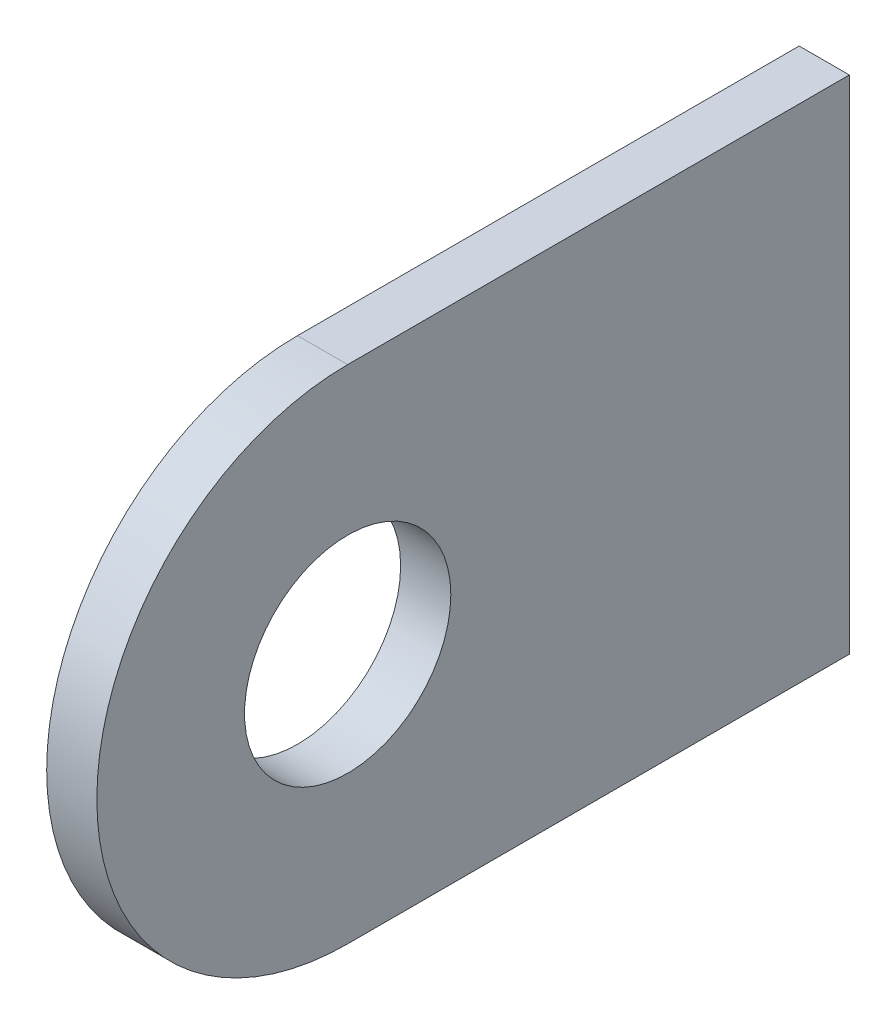
ISO-10303-21;
HEADER;
FILE_DESCRIPTION(('STEP AP214'),'2;1');
FILE_NAME('part.step','',(''),(''),'','','');
FILE_SCHEMA(('AUTOMOTIVE_DESIGN { 1 0 10303 214 1 1 1 1 }'));
ENDSEC;
DATA;
#1=APPLICATION_CONTEXT('core data for automotive mechanical design processes');
#2=APPLICATION_PROTOCOL_DEFINITION('international standard','automotive_design',2000,#1);
#3=PRODUCT_CONTEXT('',#1,'mechanical');
#4=PRODUCT('Part','Part','',(#3));
#5=PRODUCT_RELATED_PRODUCT_CATEGORY('part','',(#4));
#6=PRODUCT_DEFINITION_FORMATION('','',#4);
#7=PRODUCT_DEFINITION_CONTEXT('part definition',#1,'design');
#8=PRODUCT_DEFINITION('design','',#6,#7);
#9=PRODUCT_DEFINITION_SHAPE('','',#8);
#10=(LENGTH_UNIT() NAMED_UNIT(*) SI_UNIT(.MILLI.,.METRE.));
#11=(NAMED_UNIT(*) PLANE_ANGLE_UNIT() SI_UNIT($,.RADIAN.));
#12=(NAMED_UNIT(*) SI_UNIT($,.STERADIAN.) SOLID_ANGLE_UNIT());
#13=UNCERTAINTY_MEASURE_WITH_UNIT(LENGTH_MEASURE(1.E-05),#10,'distance_accuracy_value','');
#14=(GEOMETRIC_REPRESENTATION_CONTEXT(3) GLOBAL_UNCERTAINTY_ASSIGNED_CONTEXT((#13)) GLOBAL_UNIT_ASSIGNED_CONTEXT((#10,
#11,#12)) REPRESENTATION_CONTEXT('',''));
#15=CARTESIAN_POINT('',(0.,0.,0.));
#16=DIRECTION('',(0.,0.,1.));
#17=DIRECTION('',(1.,0.,0.));
#18=AXIS2_PLACEMENT_3D('',#15,#16,#17);
#19=CARTESIAN_POINT('',(1.5875,7.93749999999761,15.875));
#20=DIRECTION('',(0.,-1.,0.));
#21=DIRECTION('',(0.,0.,-1.));
#22=AXIS2_PLACEMENT_3D('',#19,#20,#21);
#23=PLANE('',#22);
#24=DIRECTION('',(0.,0.,1.));
#25=VECTOR('',#24,1.);
#26=CARTESIAN_POINT('',(0.,7.93749999999761,15.875));
#27=LINE('',#26,#25);
#28=CARTESIAN_POINT('',(0.,7.93749999999761,0.));
#29=VERTEX_POINT('',#28);
#30=CARTESIAN_POINT('',(0.,7.93749999999761,15.875));
#31=VERTEX_POINT('',#30);
#32=EDGE_CURVE('E108',#29,#31,#27,.T.);
#33=ORIENTED_EDGE('',*,*,#32,.T.);
#34=DIRECTION('',(-1.,0.,0.));
#35=VECTOR('',#34,1.);
#36=CARTESIAN_POINT('',(1.5875,7.93749999999761,15.875));
#37=LINE('',#36,#35);
#38=CARTESIAN_POINT('',(1.5875,7.93749999999761,15.875));
#39=VERTEX_POINT('',#38);
#40=EDGE_CURVE('E11',#39,#31,#37,.T.);
#41=ORIENTED_EDGE('',*,*,#40,.F.);
#42=DIRECTION('',(0.,0.,1.));
#43=VECTOR('',#42,1.);
#44=CARTESIAN_POINT('',(1.5875,7.93749999999761,15.875));
#45=LINE('',#44,#43);
#46=CARTESIAN_POINT('',(1.5875,7.93749999999761,0.));
#47=VERTEX_POINT('',#46);
#48=EDGE_CURVE('E94',#47,#39,#45,.T.);
#49=ORIENTED_EDGE('',*,*,#48,.F.);
#50=DIRECTION('',(-1.,0.,0.));
#51=VECTOR('',#50,1.);
#52=CARTESIAN_POINT('',(1.5875,7.93749999999761,0.));
#53=LINE('',#52,#51);
#54=EDGE_CURVE('E104',#47,#29,#53,.T.);
#55=ORIENTED_EDGE('',*,*,#54,.T.);
#56=EDGE_LOOP('',(#33,#41,#49,#55));
#57=FACE_BOUND('',#56,.T.);
#58=ADVANCED_FACE('F42',(#57),#23,.F.);
#59=CARTESIAN_POINT('',(1.5875,0.,15.875));
#60=DIRECTION('',(-1.,0.,0.));
#61=DIRECTION('',(0.,0.,1.));
#62=AXIS2_PLACEMENT_3D('',#59,#60,#61);
#63=CYLINDRICAL_SURFACE('',#62,7.93749999999761);
#64=CARTESIAN_POINT('',(0.,0.,15.875));
#65=DIRECTION('',(1.,0.,0.));
#66=DIRECTION('',(0.,0.,1.));
#67=AXIS2_PLACEMENT_3D('',#64,#65,#66);
#68=CIRCLE('',#67,7.93749999999761);
#69=CARTESIAN_POINT('',(0.,-7.93749999999761,15.875));
#70=VERTEX_POINT('',#69);
#71=EDGE_CURVE('E99',#31,#70,#68,.T.);
#72=ORIENTED_EDGE('',*,*,#71,.T.);
#73=DIRECTION('',(-1.,0.,0.));
#74=VECTOR('',#73,1.);
#75=CARTESIAN_POINT('',(1.5875,-7.93749999999761,15.875));
#76=LINE('',#75,#74);
#77=CARTESIAN_POINT('',(1.5875,-7.93749999999761,15.875));
#78=VERTEX_POINT('',#77);
#79=EDGE_CURVE('E50',#78,#70,#76,.T.);
#80=ORIENTED_EDGE('',*,*,#79,.F.);
#81=CARTESIAN_POINT('',(1.5875,0.,15.875));
#82=DIRECTION('',(1.,0.,0.));
#83=DIRECTION('',(0.,0.,1.));
#84=AXIS2_PLACEMENT_3D('',#81,#82,#83);
#85=CIRCLE('',#84,7.93749999999761);
#86=EDGE_CURVE('E89',#39,#78,#85,.T.);
#87=ORIENTED_EDGE('',*,*,#86,.F.);
#88=ORIENTED_EDGE('',*,*,#40,.T.);
#89=EDGE_LOOP('',(#72,#80,#87,#88));
#90=FACE_BOUND('',#89,.T.);
#91=ADVANCED_FACE('F98',(#90),#63,.T.);
#92=CARTESIAN_POINT('',(1.5875,-7.93749999999761,15.875));
#93=DIRECTION('',(0.,1.,0.));
#94=DIRECTION('',(0.,0.,1.));
#95=AXIS2_PLACEMENT_3D('',#92,#93,#94);
#96=PLANE('',#95);
#97=DIRECTION('',(0.,0.,-1.));
#98=VECTOR('',#97,1.);
#99=CARTESIAN_POINT('',(0.,-7.93749999999761,15.875));
#100=LINE('',#99,#98);
#101=CARTESIAN_POINT('',(0.,-7.93749999999761,0.));
#102=VERTEX_POINT('',#101);
#103=EDGE_CURVE('E76',#70,#102,#100,.T.);
#104=ORIENTED_EDGE('',*,*,#103,.T.);
#105=DIRECTION('',(-1.,0.,0.));
#106=VECTOR('',#105,1.);
#107=CARTESIAN_POINT('',(1.5875,-7.93749999999761,0.));
#108=LINE('',#107,#106);
#109=CARTESIAN_POINT('',(1.5875,-7.93749999999761,0.));
#110=VERTEX_POINT('',#109);
#111=EDGE_CURVE('E101',#110,#102,#108,.T.);
#112=ORIENTED_EDGE('',*,*,#111,.F.);
#113=DIRECTION('',(0.,0.,-1.));
#114=VECTOR('',#113,1.);
#115=CARTESIAN_POINT('',(1.5875,-7.93749999999761,15.875));
#116=LINE('',#115,#114);
#117=EDGE_CURVE('E92',#78,#110,#116,.T.);
#118=ORIENTED_EDGE('',*,*,#117,.F.);
#119=ORIENTED_EDGE('',*,*,#79,.T.);
#120=EDGE_LOOP('',(#104,#112,#118,#119));
#121=FACE_BOUND('',#120,.T.);
#122=ADVANCED_FACE('F102',(#121),#96,.F.);
#123=CARTESIAN_POINT('',(1.5875,-7.93749999999761,0.));
#124=DIRECTION('',(0.,0.,1.));
#125=DIRECTION('',(0.,-1.,0.));
#126=AXIS2_PLACEMENT_3D('',#123,#124,#125);
#127=PLANE('',#126);
#128=DIRECTION('',(0.,1.,0.));
#129=VECTOR('',#128,1.);
#130=CARTESIAN_POINT('',(0.,-7.93749999999761,0.));
#131=LINE('',#130,#129);
#132=EDGE_CURVE('E82',#102,#29,#131,.T.);
#133=ORIENTED_EDGE('',*,*,#132,.T.);
#134=ORIENTED_EDGE('',*,*,#54,.F.);
#135=DIRECTION('',(0.,1.,0.));
#136=VECTOR('',#135,1.);
#137=CARTESIAN_POINT('',(1.5875,-7.93749999999761,0.));
#138=LINE('',#137,#136);
#139=EDGE_CURVE('E58',#110,#47,#138,.T.);
#140=ORIENTED_EDGE('',*,*,#139,.F.);
#141=ORIENTED_EDGE('',*,*,#111,.T.);
#142=EDGE_LOOP('',(#133,#134,#140,#141));
#143=FACE_BOUND('',#142,.T.);
#144=ADVANCED_FACE('F118',(#143),#127,.F.);
#145=CARTESIAN_POINT('',(1.5875,0.,15.875));
#146=DIRECTION('',(-1.,0.,0.));
#147=DIRECTION('',(0.,0.,1.));
#148=AXIS2_PLACEMENT_3D('',#145,#146,#147);
#149=PLANE('',#148);
#150=CARTESIAN_POINT('',(1.5875,0.,15.875));
#151=DIRECTION('',(1.,0.,0.));
#152=DIRECTION('',(0.,0.,-1.));
#153=AXIS2_PLACEMENT_3D('',#150,#151,#152);
#154=CIRCLE('',#153,3.2639);
#155=CARTESIAN_POINT('',(1.5875,0.,12.6111));
#156=VERTEX_POINT('',#155);
#157=EDGE_CURVE('E127',#156,#156,#154,.T.);
#158=ORIENTED_EDGE('',*,*,#157,.F.);
#159=EDGE_LOOP('',(#158));
#160=FACE_BOUND('',#159,.T.);
#161=ORIENTED_EDGE('',*,*,#48,.T.);
#162=ORIENTED_EDGE('',*,*,#86,.T.);
#163=ORIENTED_EDGE('',*,*,#117,.T.);
#164=ORIENTED_EDGE('',*,*,#139,.T.);
#165=EDGE_LOOP('',(#161,#162,#163,#164));
#166=FACE_BOUND('',#165,.T.);
#167=ADVANCED_FACE('F90',(#160,#166),#149,.F.);
#168=CARTESIAN_POINT('',(0.,0.,15.875));
#169=DIRECTION('',(-1.,0.,0.));
#170=DIRECTION('',(0.,0.,1.));
#171=AXIS2_PLACEMENT_3D('',#168,#169,#170);
#172=PLANE('',#171);
#173=CARTESIAN_POINT('',(0.,0.,15.875));
#174=DIRECTION('',(1.,0.,0.));
#175=DIRECTION('',(0.,0.,-1.));
#176=AXIS2_PLACEMENT_3D('',#173,#174,#175);
#177=CIRCLE('',#176,3.2639);
#178=CARTESIAN_POINT('',(0.,0.,12.6111));
#179=VERTEX_POINT('',#178);
#180=EDGE_CURVE('E111',#179,#179,#177,.T.);
#181=ORIENTED_EDGE('',*,*,#180,.T.);
#182=EDGE_LOOP('',(#181));
#183=FACE_BOUND('',#182,.T.);
#184=ORIENTED_EDGE('',*,*,#32,.F.);
#185=ORIENTED_EDGE('',*,*,#132,.F.);
#186=ORIENTED_EDGE('',*,*,#103,.F.);
#187=ORIENTED_EDGE('',*,*,#71,.F.);
#188=EDGE_LOOP('',(#184,#185,#186,#187));
#189=FACE_BOUND('',#188,.T.);
#190=ADVANCED_FACE('F121',(#183,#189),#172,.T.);
#191=CARTESIAN_POINT('',(1.5875,0.,15.875));
#192=DIRECTION('',(1.,0.,0.));
#193=DIRECTION('',(0.,0.,-1.));
#194=AXIS2_PLACEMENT_3D('',#191,#192,#193);
#195=CYLINDRICAL_SURFACE('',#194,3.2639);
#196=ORIENTED_EDGE('',*,*,#180,.F.);
#197=EDGE_LOOP('',(#196));
#198=FACE_BOUND('',#197,.T.);
#199=ORIENTED_EDGE('',*,*,#157,.T.);
#200=EDGE_LOOP('',(#199));
#201=FACE_BOUND('',#200,.T.);
#202=ADVANCED_FACE('F132',(#198,#201),#195,.F.);
#203=CLOSED_SHELL('',(#58,#91,#122,#144,#167,#190,#202));
#204=MANIFOLD_SOLID_BREP('B2',#203);
#205=ADVANCED_BREP_SHAPE_REPRESENTATION('',(#18,#204),#14);
#206=SHAPE_DEFINITION_REPRESENTATION(#9,#205);
ENDSEC;
END-ISO-10303-21;
